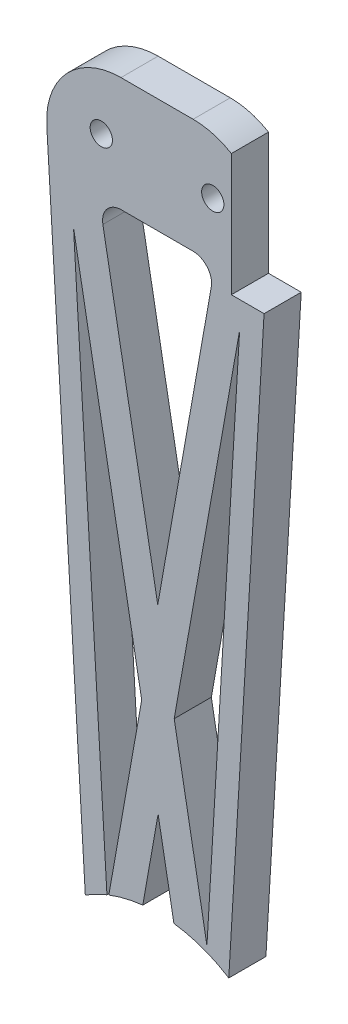
ISO-10303-21;
HEADER;
FILE_DESCRIPTION(('STEP AP214'),'2;1');
FILE_NAME('part.step','',(''),(''),'','','');
FILE_SCHEMA(('AUTOMOTIVE_DESIGN { 1 0 10303 214 1 1 1 1 }'));
ENDSEC;
DATA;
#1=APPLICATION_CONTEXT('core data for automotive mechanical design processes');
#2=APPLICATION_PROTOCOL_DEFINITION('international standard','automotive_design',2000,#1);
#3=PRODUCT_CONTEXT('',#1,'mechanical');
#4=PRODUCT('Part','Part','',(#3));
#5=PRODUCT_RELATED_PRODUCT_CATEGORY('part','',(#4));
#6=PRODUCT_DEFINITION_FORMATION('','',#4);
#7=PRODUCT_DEFINITION_CONTEXT('part definition',#1,'design');
#8=PRODUCT_DEFINITION('design','',#6,#7);
#9=PRODUCT_DEFINITION_SHAPE('','',#8);
#10=(LENGTH_UNIT() NAMED_UNIT(*) SI_UNIT(.MILLI.,.METRE.));
#11=(NAMED_UNIT(*) PLANE_ANGLE_UNIT() SI_UNIT($,.RADIAN.));
#12=(NAMED_UNIT(*) SI_UNIT($,.STERADIAN.) SOLID_ANGLE_UNIT());
#13=UNCERTAINTY_MEASURE_WITH_UNIT(LENGTH_MEASURE(1.E-05),#10,'distance_accuracy_value','');
#14=(GEOMETRIC_REPRESENTATION_CONTEXT(3) GLOBAL_UNCERTAINTY_ASSIGNED_CONTEXT((#13)) GLOBAL_UNIT_ASSIGNED_CONTEXT((#10,
#11,#12)) REPRESENTATION_CONTEXT('',''));
#15=CARTESIAN_POINT('',(0.,0.,0.));
#16=DIRECTION('',(0.,0.,1.));
#17=DIRECTION('',(1.,0.,0.));
#18=AXIS2_PLACEMENT_3D('',#15,#16,#17);
#19=CARTESIAN_POINT('',(0.,0.,10.));
#20=DIRECTION('',(0.,0.,1.));
#21=DIRECTION('',(1.,0.,0.));
#22=AXIS2_PLACEMENT_3D('',#19,#20,#21);
#23=PLANE('',#22);
#24=CARTESIAN_POINT('',(15.,0.,10.));
#25=DIRECTION('',(0.,0.,1.));
#26=DIRECTION('',(1.,0.,0.));
#27=AXIS2_PLACEMENT_3D('',#24,#25,#26);
#28=CIRCLE('',#27,3.);
#29=CARTESIAN_POINT('',(18.,0.,10.));
#30=VERTEX_POINT('',#29);
#31=EDGE_CURVE('E405',#30,#30,#28,.T.);
#32=ORIENTED_EDGE('',*,*,#31,.F.);
#33=EDGE_LOOP('',(#32));
#34=FACE_BOUND('',#33,.T.);
#35=CARTESIAN_POINT('',(-15.,0.,10.));
#36=DIRECTION('',(0.,0.,1.));
#37=DIRECTION('',(1.,0.,0.));
#38=AXIS2_PLACEMENT_3D('',#35,#36,#37);
#39=CIRCLE('',#38,3.);
#40=CARTESIAN_POINT('',(-12.,0.,10.));
#41=VERTEX_POINT('',#40);
#42=EDGE_CURVE('E408',#41,#41,#39,.T.);
#43=ORIENTED_EDGE('',*,*,#42,.F.);
#44=EDGE_LOOP('',(#43));
#45=FACE_BOUND('',#44,.T.);
#46=DIRECTION('',(0.174574666070561,0.984643938673444,0.));
#47=VECTOR('',#46,1.);
#48=CARTESIAN_POINT('',(17.7452712206691,-3.14618785126878,10.));
#49=LINE('',#48,#47);
#50=CARTESIAN_POINT('',(0.190220551076297,-102.160979768059,10.));
#51=VERTEX_POINT('',#50);
#52=CARTESIAN_POINT('',(14.6023785703389,-20.8728733303528,10.));
#53=VERTEX_POINT('',#52);
#54=EDGE_CURVE('E387',#51,#53,#49,.T.);
#55=ORIENTED_EDGE('',*,*,#54,.F.);
#56=DIRECTION('',(-0.178826073356073,0.983880701857724,0.));
#57=VECTOR('',#56,1.);
#58=CARTESIAN_POINT('',(-17.7904251161172,-3.23351384049256,10.));
#59=LINE('',#58,#57);
#60=CARTESIAN_POINT('',(-14.5805047462184,-20.8941303667804,10.));
#61=VERTEX_POINT('',#60);
#62=EDGE_CURVE('E349',#51,#61,#59,.T.);
#63=ORIENTED_EDGE('',*,*,#62,.T.);
#64=CARTESIAN_POINT('',(-9.66110123692979,-20.,10.));
#65=DIRECTION('',(0.,0.,1.));
#66=DIRECTION('',(1.,0.,0.));
#67=AXIS2_PLACEMENT_3D('',#64,#65,#66);
#68=CIRCLE('',#67,5.);
#69=CARTESIAN_POINT('',(-9.66110123692979,-15.,10.));
#70=VERTEX_POINT('',#69);
#71=EDGE_CURVE('E447',#61,#70,#68,.F.);
#72=ORIENTED_EDGE('',*,*,#71,.T.);
#73=DIRECTION('',(1.,0.,0.));
#74=VECTOR('',#73,1.);
#75=CARTESIAN_POINT('',(0.,-15.,10.));
#76=LINE('',#75,#74);
#77=CARTESIAN_POINT('',(9.67915887697167,-15.,10.));
#78=VERTEX_POINT('',#77);
#79=EDGE_CURVE('E378',#70,#78,#76,.T.);
#80=ORIENTED_EDGE('',*,*,#79,.T.);
#81=CARTESIAN_POINT('',(9.67915887697167,-20.,10.));
#82=DIRECTION('',(0.,0.,1.));
#83=DIRECTION('',(1.,0.,0.));
#84=AXIS2_PLACEMENT_3D('',#81,#82,#83);
#85=CIRCLE('',#84,5.);
#86=EDGE_CURVE('E115',#78,#53,#85,.F.);
#87=ORIENTED_EDGE('',*,*,#86,.T.);
#88=EDGE_LOOP('',(#55,#63,#72,#80,#87));
#89=FACE_BOUND('',#88,.T.);
#90=DIRECTION('',(-0.178826073356073,0.983880701857724,0.));
#91=VECTOR('',#90,1.);
#92=CARTESIAN_POINT('',(-17.7904251161172,-3.23351384049256,10.));
#93=LINE('',#92,#91);
#94=CARTESIAN_POINT('',(13.4301626709257,-175.005634358752,10.));
#95=VERTEX_POINT('',#94);
#96=CARTESIAN_POINT('',(4.61598635326493,-126.511039476885,10.));
#97=VERTEX_POINT('',#96);
#98=EDGE_CURVE('E363',#95,#97,#93,.T.);
#99=ORIENTED_EDGE('',*,*,#98,.T.);
#100=DIRECTION('',(0.174574666070561,0.984643938673444,0.));
#101=VECTOR('',#100,1.);
#102=CARTESIAN_POINT('',(26.2217824014059,-4.64905000346376,10.));
#103=LINE('',#102,#101);
#104=CARTESIAN_POINT('',(22.2304198411749,-27.1613138985647,10.));
#105=VERTEX_POINT('',#104);
#106=EDGE_CURVE('E329',#97,#105,#103,.T.);
#107=ORIENTED_EDGE('',*,*,#106,.T.);
#108=DIRECTION('',(-0.0594186399842153,-0.998233151734817,0.));
#109=VECTOR('',#108,1.);
#110=CARTESIAN_POINT('',(23.7629705178262,-1.41446253082299,10.));
#111=LINE('',#110,#109);
#112=EDGE_CURVE('E355',#105,#95,#111,.T.);
#113=ORIENTED_EDGE('',*,*,#112,.T.);
#114=EDGE_LOOP('',(#99,#107,#113));
#115=FACE_BOUND('',#114,.T.);
#116=DIRECTION('',(-0.0594186399842153,-0.998233151734817,0.));
#117=VECTOR('',#116,1.);
#118=CARTESIAN_POINT('',(29.8940827566728,-1.77940968789719,10.));
#119=LINE('',#118,#117);
#120=CARTESIAN_POINT('',(28.8095238095238,-20.,10.));
#121=VERTEX_POINT('',#120);
#122=CARTESIAN_POINT('',(19.3085635130686,-179.616132980448,10.));
#123=VERTEX_POINT('',#122);
#124=EDGE_CURVE('E398',#121,#123,#119,.T.);
#125=ORIENTED_EDGE('',*,*,#124,.F.);
#126=DIRECTION('',(-1.,0.,0.));
#127=VECTOR('',#126,1.);
#128=CARTESIAN_POINT('',(0.,-20.,10.));
#129=LINE('',#128,#127);
#130=CARTESIAN_POINT('',(20.,-20.,10.));
#131=VERTEX_POINT('',#130);
#132=EDGE_CURVE('E281',#121,#131,#129,.T.);
#133=ORIENTED_EDGE('',*,*,#132,.T.);
#134=DIRECTION('',(0.,-1.,0.));
#135=VECTOR('',#134,1.);
#136=CARTESIAN_POINT('',(20.,0.,10.));
#137=LINE('',#136,#135);
#138=CARTESIAN_POINT('',(20.,12.9219237424976,10.));
#139=VERTEX_POINT('',#138);
#140=EDGE_CURVE('E274',#139,#131,#137,.T.);
#141=ORIENTED_EDGE('',*,*,#140,.F.);
#142=CARTESIAN_POINT('',(9.71283934950197,-4.22958714578407,10.));
#143=DIRECTION('',(0.,0.,1.));
#144=DIRECTION('',(1.,0.,0.));
#145=AXIS2_PLACEMENT_3D('',#142,#143,#144);
#146=CIRCLE('',#145,20.);
#147=CARTESIAN_POINT('',(9.71283934950197,15.7704128542159,10.));
#148=VERTEX_POINT('',#147);
#149=EDGE_CURVE('E435',#139,#148,#146,.T.);
#150=ORIENTED_EDGE('',*,*,#149,.T.);
#151=DIRECTION('',(1.,0.,0.));
#152=VECTOR('',#151,1.);
#153=CARTESIAN_POINT('',(0.,15.7704128542159,10.));
#154=LINE('',#153,#152);
#155=CARTESIAN_POINT('',(-9.71283934950197,15.7704128542159,10.));
#156=VERTEX_POINT('',#155);
#157=EDGE_CURVE('E402',#156,#148,#154,.T.);
#158=ORIENTED_EDGE('',*,*,#157,.F.);
#159=CARTESIAN_POINT('',(-9.71283934950197,-4.22958714578407,10.));
#160=DIRECTION('',(0.,0.,1.));
#161=DIRECTION('',(1.,0.,0.));
#162=AXIS2_PLACEMENT_3D('',#159,#160,#161);
#163=CIRCLE('',#162,20.);
#164=CARTESIAN_POINT('',(-29.6775023841983,-5.41795994546837,10.));
#165=VERTEX_POINT('',#164);
#166=EDGE_CURVE('E429',#156,#165,#163,.T.);
#167=ORIENTED_EDGE('',*,*,#166,.T.);
#168=DIRECTION('',(0.0594186399842153,-0.998233151734817,0.));
#169=VECTOR('',#168,1.);
#170=CARTESIAN_POINT('',(-29.8940827566728,-1.77940968789719,10.));
#171=LINE('',#170,#169);
#172=CARTESIAN_POINT('',(-19.3085635130686,-179.616132980448,10.));
#173=VERTEX_POINT('',#172);
#174=EDGE_CURVE('E395',#165,#173,#171,.T.);
#175=ORIENTED_EDGE('',*,*,#174,.T.);
#176=CARTESIAN_POINT('',(0.,-210.,10.));
#177=DIRECTION('',(0.,0.,1.));
#178=DIRECTION('',(1.,0.,0.));
#179=AXIS2_PLACEMENT_3D('',#176,#177,#178);
#180=CIRCLE('',#179,36.);
#181=CARTESIAN_POINT('',(-13.4867994081427,-176.621769943202,10.));
#182=VERTEX_POINT('',#181);
#183=EDGE_CURVE('E302',#182,#173,#180,.T.);
#184=ORIENTED_EDGE('',*,*,#183,.F.);
#185=DIRECTION('',(-0.0594186399842153,0.998233151734817,0.));
#186=VECTOR('',#185,1.);
#187=CARTESIAN_POINT('',(-23.9152662053382,-1.42352775031775,10.));
#188=LINE('',#187,#186);
#189=CARTESIAN_POINT('',(-22.4730270714025,-25.6531452004381,10.));
#190=VERTEX_POINT('',#189);
#191=EDGE_CURVE('E339',#182,#190,#188,.T.);
#192=ORIENTED_EDGE('',*,*,#191,.T.);
#193=DIRECTION('',(-0.178826073356073,0.983880701857724,0.));
#194=VECTOR('',#193,1.);
#195=CARTESIAN_POINT('',(-26.2678721622271,-4.77433943497515,10.));
#196=LINE('',#195,#194);
#197=CARTESIAN_POINT('',(-4.13415620386734,-126.551525407566,10.));
#198=VERTEX_POINT('',#197);
#199=EDGE_CURVE('E333',#198,#190,#196,.T.);
#200=ORIENTED_EDGE('',*,*,#199,.F.);
#201=DIRECTION('',(0.174574666070561,0.984643938673444,0.));
#202=VECTOR('',#201,1.);
#203=CARTESIAN_POINT('',(17.7452712206691,-3.14618785126878,10.));
#204=LINE('',#203,#202);
#205=CARTESIAN_POINT('',(-12.9756578020108,-176.419763184201,10.));
#206=VERTEX_POINT('',#205);
#207=EDGE_CURVE('E341',#206,#198,#204,.T.);
#208=ORIENTED_EDGE('',*,*,#207,.F.);
#209=CARTESIAN_POINT('',(0.,-210.,10.));
#210=DIRECTION('',(0.,0.,1.));
#211=DIRECTION('',(1.,0.,0.));
#212=AXIS2_PLACEMENT_3D('',#209,#210,#211);
#213=CIRCLE('',#212,36.);
#214=CARTESIAN_POINT('',(-3.84009202515425,-174.205395752455,10.));
#215=VERTEX_POINT('',#214);
#216=EDGE_CURVE('E300',#215,#206,#213,.T.);
#217=ORIENTED_EDGE('',*,*,#216,.F.);
#218=DIRECTION('',(0.174574666070561,0.984643938673444,0.));
#219=VECTOR('',#218,1.);
#220=CARTESIAN_POINT('',(26.2217824014059,-4.64905000346376,10.));
#221=LINE('',#220,#219);
#222=CARTESIAN_POINT('',(0.29160959832128,-150.901585116392,10.));
#223=VERTEX_POINT('',#222);
#224=EDGE_CURVE('E321',#215,#223,#221,.T.);
#225=ORIENTED_EDGE('',*,*,#224,.T.);
#226=DIRECTION('',(-0.178826073356073,0.983880701857724,0.));
#227=VECTOR('',#226,1.);
#228=CARTESIAN_POINT('',(-26.2678721622271,-4.77433943497515,10.));
#229=LINE('',#228,#227);
#230=CARTESIAN_POINT('',(4.54217202074157,-174.287695771149,10.));
#231=VERTEX_POINT('',#230);
#232=EDGE_CURVE('E287',#231,#223,#229,.T.);
#233=ORIENTED_EDGE('',*,*,#232,.F.);
#234=CARTESIAN_POINT('',(0.,-210.,10.));
#235=DIRECTION('',(0.,0.,1.));
#236=DIRECTION('',(1.,0.,0.));
#237=AXIS2_PLACEMENT_3D('',#234,#235,#236);
#238=CIRCLE('',#237,36.);
#239=EDGE_CURVE('E130',#123,#231,#238,.T.);
#240=ORIENTED_EDGE('',*,*,#239,.F.);
#241=EDGE_LOOP('',(#125,#133,#141,#150,#158,#167,#175,#184,#192,#200,#208,#217,#225,#233,#240));
#242=FACE_BOUND('',#241,.T.);
#243=ADVANCED_FACE('F107',(#34,#45,#89,#115,#242),#23,.T.);
#244=CARTESIAN_POINT('',(0.,0.,0.));
#245=DIRECTION('',(0.,0.,1.));
#246=DIRECTION('',(1.,0.,0.));
#247=AXIS2_PLACEMENT_3D('',#244,#245,#246);
#248=PLANE('',#247);
#249=CARTESIAN_POINT('',(-15.,0.,0.));
#250=DIRECTION('',(0.,0.,1.));
#251=DIRECTION('',(1.,0.,0.));
#252=AXIS2_PLACEMENT_3D('',#249,#250,#251);
#253=CIRCLE('',#252,3.);
#254=CARTESIAN_POINT('',(-12.,0.,0.));
#255=VERTEX_POINT('',#254);
#256=EDGE_CURVE('E399',#255,#255,#253,.T.);
#257=ORIENTED_EDGE('',*,*,#256,.T.);
#258=EDGE_LOOP('',(#257));
#259=FACE_BOUND('',#258,.T.);
#260=CARTESIAN_POINT('',(15.,0.,0.));
#261=DIRECTION('',(0.,0.,1.));
#262=DIRECTION('',(1.,0.,0.));
#263=AXIS2_PLACEMENT_3D('',#260,#261,#262);
#264=CIRCLE('',#263,3.);
#265=CARTESIAN_POINT('',(18.,0.,0.));
#266=VERTEX_POINT('',#265);
#267=EDGE_CURVE('E418',#266,#266,#264,.T.);
#268=ORIENTED_EDGE('',*,*,#267,.T.);
#269=EDGE_LOOP('',(#268));
#270=FACE_BOUND('',#269,.T.);
#271=DIRECTION('',(-0.178826073356073,0.983880701857724,0.));
#272=VECTOR('',#271,1.);
#273=CARTESIAN_POINT('',(-17.7904251161172,-3.23351384049256,0.));
#274=LINE('',#273,#272);
#275=CARTESIAN_POINT('',(0.190220551076304,-102.160979768059,0.));
#276=VERTEX_POINT('',#275);
#277=CARTESIAN_POINT('',(-14.5805047462184,-20.8941303667804,0.));
#278=VERTEX_POINT('',#277);
#279=EDGE_CURVE('E374',#276,#278,#274,.T.);
#280=ORIENTED_EDGE('',*,*,#279,.F.);
#281=DIRECTION('',(0.174574666070561,0.984643938673444,0.));
#282=VECTOR('',#281,1.);
#283=CARTESIAN_POINT('',(17.7452712206691,-3.14618785126878,0.));
#284=LINE('',#283,#282);
#285=CARTESIAN_POINT('',(14.6023785703389,-20.8728733303528,0.));
#286=VERTEX_POINT('',#285);
#287=EDGE_CURVE('E377',#276,#286,#284,.T.);
#288=ORIENTED_EDGE('',*,*,#287,.T.);
#289=CARTESIAN_POINT('',(9.67915887697167,-20.,0.));
#290=DIRECTION('',(0.,0.,1.));
#291=DIRECTION('',(1.,0.,0.));
#292=AXIS2_PLACEMENT_3D('',#289,#290,#291);
#293=CIRCLE('',#292,5.);
#294=CARTESIAN_POINT('',(9.67915887697167,-15.,0.));
#295=VERTEX_POINT('',#294);
#296=EDGE_CURVE('E12',#286,#295,#293,.T.);
#297=ORIENTED_EDGE('',*,*,#296,.T.);
#298=DIRECTION('',(1.,0.,0.));
#299=VECTOR('',#298,1.);
#300=CARTESIAN_POINT('',(0.,-15.,0.));
#301=LINE('',#300,#299);
#302=CARTESIAN_POINT('',(-9.66110123692979,-15.,0.));
#303=VERTEX_POINT('',#302);
#304=EDGE_CURVE('E381',#303,#295,#301,.T.);
#305=ORIENTED_EDGE('',*,*,#304,.F.);
#306=CARTESIAN_POINT('',(-9.66110123692979,-20.,0.));
#307=DIRECTION('',(0.,0.,1.));
#308=DIRECTION('',(1.,0.,0.));
#309=AXIS2_PLACEMENT_3D('',#306,#307,#308);
#310=CIRCLE('',#309,5.);
#311=EDGE_CURVE('E449',#303,#278,#310,.T.);
#312=ORIENTED_EDGE('',*,*,#311,.T.);
#313=EDGE_LOOP('',(#280,#288,#297,#305,#312));
#314=FACE_BOUND('',#313,.T.);
#315=DIRECTION('',(0.174574666070561,0.984643938673444,0.));
#316=VECTOR('',#315,1.);
#317=CARTESIAN_POINT('',(26.2217824014059,-4.64905000346376,0.));
#318=LINE('',#317,#316);
#319=CARTESIAN_POINT('',(4.61598635326493,-126.511039476885,0.));
#320=VERTEX_POINT('',#319);
#321=CARTESIAN_POINT('',(22.2304198411749,-27.1613138985647,0.));
#322=VERTEX_POINT('',#321);
#323=EDGE_CURVE('E352',#320,#322,#318,.T.);
#324=ORIENTED_EDGE('',*,*,#323,.F.);
#325=DIRECTION('',(-0.178826073356073,0.983880701857724,0.));
#326=VECTOR('',#325,1.);
#327=CARTESIAN_POINT('',(-17.7904251161172,-3.23351384049256,0.));
#328=LINE('',#327,#326);
#329=CARTESIAN_POINT('',(13.4301626709257,-175.005634358752,0.));
#330=VERTEX_POINT('',#329);
#331=EDGE_CURVE('E354',#330,#320,#328,.T.);
#332=ORIENTED_EDGE('',*,*,#331,.F.);
#333=DIRECTION('',(-0.0594186399842153,-0.998233151734817,0.));
#334=VECTOR('',#333,1.);
#335=CARTESIAN_POINT('',(23.7629705178262,-1.41446253082299,0.));
#336=LINE('',#335,#334);
#337=EDGE_CURVE('E357',#322,#330,#336,.T.);
#338=ORIENTED_EDGE('',*,*,#337,.F.);
#339=EDGE_LOOP('',(#324,#332,#338));
#340=FACE_BOUND('',#339,.T.);
#341=DIRECTION('',(-1.,0.,0.));
#342=VECTOR('',#341,1.);
#343=CARTESIAN_POINT('',(0.,-20.,0.));
#344=LINE('',#343,#342);
#345=CARTESIAN_POINT('',(28.8095238095238,-20.,0.));
#346=VERTEX_POINT('',#345);
#347=CARTESIAN_POINT('',(20.,-20.,0.));
#348=VERTEX_POINT('',#347);
#349=EDGE_CURVE('E261',#346,#348,#344,.T.);
#350=ORIENTED_EDGE('',*,*,#349,.F.);
#351=DIRECTION('',(-0.0594186399842153,-0.998233151734817,0.));
#352=VECTOR('',#351,1.);
#353=CARTESIAN_POINT('',(29.8940827566728,-1.77940968789719,0.));
#354=LINE('',#353,#352);
#355=CARTESIAN_POINT('',(19.3085635130686,-179.616132980448,0.));
#356=VERTEX_POINT('',#355);
#357=EDGE_CURVE('E414',#346,#356,#354,.T.);
#358=ORIENTED_EDGE('',*,*,#357,.T.);
#359=CARTESIAN_POINT('',(0.,-210.,0.));
#360=DIRECTION('',(0.,0.,1.));
#361=DIRECTION('',(1.,0.,0.));
#362=AXIS2_PLACEMENT_3D('',#359,#360,#361);
#363=CIRCLE('',#362,36.);
#364=CARTESIAN_POINT('',(4.54217202074156,-174.287695771149,0.));
#365=VERTEX_POINT('',#364);
#366=EDGE_CURVE('E296',#356,#365,#363,.T.);
#367=ORIENTED_EDGE('',*,*,#366,.T.);
#368=DIRECTION('',(-0.178826073356073,0.983880701857724,0.));
#369=VECTOR('',#368,1.);
#370=CARTESIAN_POINT('',(-26.2678721622271,-4.77433943497515,0.));
#371=LINE('',#370,#369);
#372=CARTESIAN_POINT('',(0.291609598321283,-150.901585116392,0.));
#373=VERTEX_POINT('',#372);
#374=EDGE_CURVE('E317',#365,#373,#371,.T.);
#375=ORIENTED_EDGE('',*,*,#374,.T.);
#376=DIRECTION('',(0.174574666070561,0.984643938673444,0.));
#377=VECTOR('',#376,1.);
#378=CARTESIAN_POINT('',(26.2217824014059,-4.64905000346376,0.));
#379=LINE('',#378,#377);
#380=CARTESIAN_POINT('',(-3.84009202515425,-174.205395752455,0.));
#381=VERTEX_POINT('',#380);
#382=EDGE_CURVE('E320',#381,#373,#379,.T.);
#383=ORIENTED_EDGE('',*,*,#382,.F.);
#384=CARTESIAN_POINT('',(0.,-210.,0.));
#385=DIRECTION('',(0.,0.,1.));
#386=DIRECTION('',(1.,0.,0.));
#387=AXIS2_PLACEMENT_3D('',#384,#385,#386);
#388=CIRCLE('',#387,36.);
#389=CARTESIAN_POINT('',(-12.9756578020108,-176.419763184201,0.));
#390=VERTEX_POINT('',#389);
#391=EDGE_CURVE('E290',#381,#390,#388,.T.);
#392=ORIENTED_EDGE('',*,*,#391,.T.);
#393=DIRECTION('',(0.174574666070561,0.984643938673444,0.));
#394=VECTOR('',#393,1.);
#395=CARTESIAN_POINT('',(17.7452712206691,-3.14618785126878,0.));
#396=LINE('',#395,#394);
#397=CARTESIAN_POINT('',(-4.13415620386734,-126.551525407566,0.));
#398=VERTEX_POINT('',#397);
#399=EDGE_CURVE('E332',#390,#398,#396,.T.);
#400=ORIENTED_EDGE('',*,*,#399,.T.);
#401=DIRECTION('',(-0.178826073356073,0.983880701857724,0.));
#402=VECTOR('',#401,1.);
#403=CARTESIAN_POINT('',(-26.2678721622271,-4.77433943497515,0.));
#404=LINE('',#403,#402);
#405=CARTESIAN_POINT('',(-22.4730270714025,-25.6531452004381,0.));
#406=VERTEX_POINT('',#405);
#407=EDGE_CURVE('E335',#398,#406,#404,.T.);
#408=ORIENTED_EDGE('',*,*,#407,.T.);
#409=DIRECTION('',(-0.0594186399842153,0.998233151734817,0.));
#410=VECTOR('',#409,1.);
#411=CARTESIAN_POINT('',(-23.9152662053382,-1.42352775031775,0.));
#412=LINE('',#411,#410);
#413=CARTESIAN_POINT('',(-13.4867994081427,-176.621769943202,0.));
#414=VERTEX_POINT('',#413);
#415=EDGE_CURVE('E330',#414,#406,#412,.T.);
#416=ORIENTED_EDGE('',*,*,#415,.F.);
#417=CARTESIAN_POINT('',(0.,-210.,0.));
#418=DIRECTION('',(0.,0.,1.));
#419=DIRECTION('',(1.,0.,0.));
#420=AXIS2_PLACEMENT_3D('',#417,#418,#419);
#421=CIRCLE('',#420,36.);
#422=CARTESIAN_POINT('',(-19.3085635130686,-179.616132980448,0.));
#423=VERTEX_POINT('',#422);
#424=EDGE_CURVE('E293',#414,#423,#421,.T.);
#425=ORIENTED_EDGE('',*,*,#424,.T.);
#426=DIRECTION('',(0.0594186399842153,-0.998233151734817,0.));
#427=VECTOR('',#426,1.);
#428=CARTESIAN_POINT('',(-29.8940827566728,-1.77940968789719,0.));
#429=LINE('',#428,#427);
#430=CARTESIAN_POINT('',(-29.6775023841983,-5.41795994546837,0.));
#431=VERTEX_POINT('',#430);
#432=EDGE_CURVE('E394',#431,#423,#429,.T.);
#433=ORIENTED_EDGE('',*,*,#432,.F.);
#434=CARTESIAN_POINT('',(-9.71283934950197,-4.22958714578407,0.));
#435=DIRECTION('',(0.,0.,1.));
#436=DIRECTION('',(1.,0.,0.));
#437=AXIS2_PLACEMENT_3D('',#434,#435,#436);
#438=CIRCLE('',#437,20.);
#439=CARTESIAN_POINT('',(-9.71283934950197,15.7704128542159,0.));
#440=VERTEX_POINT('',#439);
#441=EDGE_CURVE('E425',#431,#440,#438,.F.);
#442=ORIENTED_EDGE('',*,*,#441,.T.);
#443=DIRECTION('',(1.,0.,0.));
#444=VECTOR('',#443,1.);
#445=CARTESIAN_POINT('',(0.,15.7704128542159,0.));
#446=LINE('',#445,#444);
#447=CARTESIAN_POINT('',(9.71283934950197,15.7704128542159,0.));
#448=VERTEX_POINT('',#447);
#449=EDGE_CURVE('E416',#440,#448,#446,.T.);
#450=ORIENTED_EDGE('',*,*,#449,.T.);
#451=CARTESIAN_POINT('',(9.71283934950197,-4.22958714578407,0.));
#452=DIRECTION('',(0.,0.,1.));
#453=DIRECTION('',(1.,0.,0.));
#454=AXIS2_PLACEMENT_3D('',#451,#452,#453);
#455=CIRCLE('',#454,20.);
#456=CARTESIAN_POINT('',(20.,12.9219237424976,0.));
#457=VERTEX_POINT('',#456);
#458=EDGE_CURVE('E280',#448,#457,#455,.F.);
#459=ORIENTED_EDGE('',*,*,#458,.T.);
#460=DIRECTION('',(0.,-1.,0.));
#461=VECTOR('',#460,1.);
#462=CARTESIAN_POINT('',(20.,0.,0.));
#463=LINE('',#462,#461);
#464=EDGE_CURVE('E122',#457,#348,#463,.T.);
#465=ORIENTED_EDGE('',*,*,#464,.T.);
#466=EDGE_LOOP('',(#350,#358,#367,#375,#383,#392,#400,#408,#416,#425,#433,#442,#450,#459,#465));
#467=FACE_BOUND('',#466,.T.);
#468=ADVANCED_FACE('F278',(#259,#270,#314,#340,#467),#248,.F.);
#469=CARTESIAN_POINT('',(29.8940827566728,-1.77940968789719,10.));
#470=DIRECTION('',(0.998233151734817,-0.0594186399842152,0.));
#471=DIRECTION('',(0.0594186399842152,0.998233151734817,0.));
#472=AXIS2_PLACEMENT_3D('',#469,#470,#471);
#473=PLANE('',#472);
#474=ORIENTED_EDGE('',*,*,#357,.F.);
#475=DIRECTION('',(0.,0.,1.));
#476=VECTOR('',#475,1.);
#477=CARTESIAN_POINT('',(28.8095238095238,-20.,0.));
#478=LINE('',#477,#476);
#479=EDGE_CURVE('E266',#346,#121,#478,.T.);
#480=ORIENTED_EDGE('',*,*,#479,.T.);
#481=ORIENTED_EDGE('',*,*,#124,.T.);
#482=DIRECTION('',(0.,0.,1.));
#483=VECTOR('',#482,1.);
#484=CARTESIAN_POINT('',(19.3085635130686,-179.616132980448,0.));
#485=LINE('',#484,#483);
#486=EDGE_CURVE('E306',#356,#123,#485,.T.);
#487=ORIENTED_EDGE('',*,*,#486,.F.);
#488=EDGE_LOOP('',(#474,#480,#481,#487));
#489=FACE_BOUND('',#488,.T.);
#490=ADVANCED_FACE('F494',(#489),#473,.T.);
#491=CARTESIAN_POINT('',(-29.8940827566728,-1.77940968789719,10.));
#492=DIRECTION('',(0.998233151734817,0.0594186399842152,0.));
#493=DIRECTION('',(-0.0594186399842152,0.998233151734817,0.));
#494=AXIS2_PLACEMENT_3D('',#491,#492,#493);
#495=PLANE('',#494);
#496=ORIENTED_EDGE('',*,*,#432,.T.);
#497=DIRECTION('',(0.,0.,1.));
#498=VECTOR('',#497,1.);
#499=CARTESIAN_POINT('',(-19.3085635130686,-179.616132980448,0.));
#500=LINE('',#499,#498);
#501=EDGE_CURVE('E308',#423,#173,#500,.T.);
#502=ORIENTED_EDGE('',*,*,#501,.T.);
#503=ORIENTED_EDGE('',*,*,#174,.F.);
#504=DIRECTION('',(0.,0.,-1.));
#505=VECTOR('',#504,1.);
#506=CARTESIAN_POINT('',(-29.6775023841983,-5.41795994546837,0.));
#507=LINE('',#506,#505);
#508=EDGE_CURVE('E411',#165,#431,#507,.T.);
#509=ORIENTED_EDGE('',*,*,#508,.T.);
#510=EDGE_LOOP('',(#496,#502,#503,#509));
#511=FACE_BOUND('',#510,.T.);
#512=ADVANCED_FACE('F511',(#511),#495,.F.);
#513=CARTESIAN_POINT('',(0.,15.7704128542159,10.));
#514=DIRECTION('',(0.,1.,0.));
#515=DIRECTION('',(0.,0.,1.));
#516=AXIS2_PLACEMENT_3D('',#513,#514,#515);
#517=PLANE('',#516);
#518=ORIENTED_EDGE('',*,*,#157,.T.);
#519=DIRECTION('',(0.,0.,-1.));
#520=VECTOR('',#519,1.);
#521=CARTESIAN_POINT('',(9.71283934950197,15.7704128542159,10.));
#522=LINE('',#521,#520);
#523=EDGE_CURVE('E431',#148,#448,#522,.T.);
#524=ORIENTED_EDGE('',*,*,#523,.T.);
#525=ORIENTED_EDGE('',*,*,#449,.F.);
#526=DIRECTION('',(0.,0.,-1.));
#527=VECTOR('',#526,1.);
#528=CARTESIAN_POINT('',(-9.71283934950197,15.7704128542159,10.));
#529=LINE('',#528,#527);
#530=EDGE_CURVE('E427',#440,#156,#529,.F.);
#531=ORIENTED_EDGE('',*,*,#530,.T.);
#532=EDGE_LOOP('',(#518,#524,#525,#531));
#533=FACE_BOUND('',#532,.T.);
#534=ADVANCED_FACE('F504',(#533),#517,.T.);
#535=CARTESIAN_POINT('',(-15.,0.,10.));
#536=DIRECTION('',(0.,0.,-1.));
#537=DIRECTION('',(-1.,0.,0.));
#538=AXIS2_PLACEMENT_3D('',#535,#536,#537);
#539=CYLINDRICAL_SURFACE('',#538,3.);
#540=ORIENTED_EDGE('',*,*,#42,.T.);
#541=EDGE_LOOP('',(#540));
#542=FACE_BOUND('',#541,.T.);
#543=ORIENTED_EDGE('',*,*,#256,.F.);
#544=EDGE_LOOP('',(#543));
#545=FACE_BOUND('',#544,.T.);
#546=ADVANCED_FACE('F500',(#542,#545),#539,.F.);
#547=CARTESIAN_POINT('',(15.,0.,10.));
#548=DIRECTION('',(0.,0.,-1.));
#549=DIRECTION('',(-1.,0.,0.));
#550=AXIS2_PLACEMENT_3D('',#547,#548,#549);
#551=CYLINDRICAL_SURFACE('',#550,3.);
#552=ORIENTED_EDGE('',*,*,#31,.T.);
#553=EDGE_LOOP('',(#552));
#554=FACE_BOUND('',#553,.T.);
#555=ORIENTED_EDGE('',*,*,#267,.F.);
#556=EDGE_LOOP('',(#555));
#557=FACE_BOUND('',#556,.T.);
#558=ADVANCED_FACE('F503',(#554,#557),#551,.F.);
#559=CARTESIAN_POINT('',(-9.71283934950197,-4.22958714578407,10.));
#560=DIRECTION('',(0.,0.,1.));
#561=DIRECTION('',(1.,0.,0.));
#562=AXIS2_PLACEMENT_3D('',#559,#560,#561);
#563=CYLINDRICAL_SURFACE('',#562,20.);
#564=ORIENTED_EDGE('',*,*,#166,.F.);
#565=ORIENTED_EDGE('',*,*,#530,.F.);
#566=ORIENTED_EDGE('',*,*,#441,.F.);
#567=ORIENTED_EDGE('',*,*,#508,.F.);
#568=EDGE_LOOP('',(#564,#565,#566,#567));
#569=FACE_BOUND('',#568,.T.);
#570=ADVANCED_FACE('F483',(#569),#563,.T.);
#571=CARTESIAN_POINT('',(9.71283934950197,-4.22958714578407,10.));
#572=DIRECTION('',(0.,0.,-1.));
#573=DIRECTION('',(-1.,0.,0.));
#574=AXIS2_PLACEMENT_3D('',#571,#572,#573);
#575=CYLINDRICAL_SURFACE('',#574,20.);
#576=DIRECTION('',(0.,0.,1.));
#577=VECTOR('',#576,1.);
#578=CARTESIAN_POINT('',(20.,12.9219237424976,0.));
#579=LINE('',#578,#577);
#580=EDGE_CURVE('E270',#457,#139,#579,.T.);
#581=ORIENTED_EDGE('',*,*,#580,.F.);
#582=ORIENTED_EDGE('',*,*,#458,.F.);
#583=ORIENTED_EDGE('',*,*,#523,.F.);
#584=ORIENTED_EDGE('',*,*,#149,.F.);
#585=EDGE_LOOP('',(#581,#582,#583,#584));
#586=FACE_BOUND('',#585,.T.);
#587=ADVANCED_FACE('F475',(#586),#575,.T.);
#588=CARTESIAN_POINT('',(-17.7904251161172,-3.23351384049256,0.));
#589=DIRECTION('',(0.983880701857725,0.178826073356073,0.));
#590=DIRECTION('',(-0.178826073356073,0.983880701857725,0.));
#591=AXIS2_PLACEMENT_3D('',#588,#589,#590);
#592=PLANE('',#591);
#593=ORIENTED_EDGE('',*,*,#279,.T.);
#594=DIRECTION('',(0.,0.,1.));
#595=VECTOR('',#594,1.);
#596=CARTESIAN_POINT('',(-14.5805047462184,-20.8941303667804,10.));
#597=LINE('',#596,#595);
#598=EDGE_CURVE('E437',#278,#61,#597,.T.);
#599=ORIENTED_EDGE('',*,*,#598,.T.);
#600=ORIENTED_EDGE('',*,*,#62,.F.);
#601=DIRECTION('',(0.,0.,1.));
#602=VECTOR('',#601,1.);
#603=CARTESIAN_POINT('',(0.190220551076304,-102.160979768059,0.));
#604=LINE('',#603,#602);
#605=EDGE_CURVE('E384',#276,#51,#604,.T.);
#606=ORIENTED_EDGE('',*,*,#605,.F.);
#607=EDGE_LOOP('',(#593,#599,#600,#606));
#608=FACE_BOUND('',#607,.T.);
#609=ADVANCED_FACE('F473',(#608),#592,.T.);
#610=CARTESIAN_POINT('',(0.,-15.,0.));
#611=DIRECTION('',(0.,-1.,0.));
#612=DIRECTION('',(0.,0.,-1.));
#613=AXIS2_PLACEMENT_3D('',#610,#611,#612);
#614=PLANE('',#613);
#615=ORIENTED_EDGE('',*,*,#79,.F.);
#616=DIRECTION('',(0.,0.,1.));
#617=VECTOR('',#616,1.);
#618=CARTESIAN_POINT('',(-9.66110123692979,-15.,0.));
#619=LINE('',#618,#617);
#620=EDGE_CURVE('E443',#70,#303,#619,.F.);
#621=ORIENTED_EDGE('',*,*,#620,.T.);
#622=ORIENTED_EDGE('',*,*,#304,.T.);
#623=DIRECTION('',(0.,0.,1.));
#624=VECTOR('',#623,1.);
#625=CARTESIAN_POINT('',(9.67915887697167,-15.,0.));
#626=LINE('',#625,#624);
#627=EDGE_CURVE('E440',#295,#78,#626,.T.);
#628=ORIENTED_EDGE('',*,*,#627,.T.);
#629=EDGE_LOOP('',(#615,#621,#622,#628));
#630=FACE_BOUND('',#629,.T.);
#631=ADVANCED_FACE('F467',(#630),#614,.T.);
#632=CARTESIAN_POINT('',(17.7452712206691,-3.14618785126878,0.));
#633=DIRECTION('',(0.984643938673444,-0.174574666070561,0.));
#634=DIRECTION('',(0.174574666070561,0.984643938673444,0.));
#635=AXIS2_PLACEMENT_3D('',#632,#633,#634);
#636=PLANE('',#635);
#637=ORIENTED_EDGE('',*,*,#54,.T.);
#638=DIRECTION('',(0.,0.,1.));
#639=VECTOR('',#638,1.);
#640=CARTESIAN_POINT('',(14.6023785703389,-20.8728733303528,0.));
#641=LINE('',#640,#639);
#642=EDGE_CURVE('E445',#53,#286,#641,.F.);
#643=ORIENTED_EDGE('',*,*,#642,.T.);
#644=ORIENTED_EDGE('',*,*,#287,.F.);
#645=ORIENTED_EDGE('',*,*,#605,.T.);
#646=EDGE_LOOP('',(#637,#643,#644,#645));
#647=FACE_BOUND('',#646,.T.);
#648=ADVANCED_FACE('F458',(#647),#636,.F.);
#649=CARTESIAN_POINT('',(26.2217824014059,-4.64905000346376,0.));
#650=DIRECTION('',(0.984643938673444,-0.174574666070561,0.));
#651=DIRECTION('',(0.174574666070561,0.984643938673444,0.));
#652=AXIS2_PLACEMENT_3D('',#649,#650,#651);
#653=PLANE('',#652);
#654=DIRECTION('',(0.,0.,1.));
#655=VECTOR('',#654,1.);
#656=CARTESIAN_POINT('',(-3.84009202515425,-174.205395752455,0.));
#657=LINE('',#656,#655);
#658=EDGE_CURVE('E299',#381,#215,#657,.T.);
#659=ORIENTED_EDGE('',*,*,#658,.F.);
#660=ORIENTED_EDGE('',*,*,#382,.T.);
#661=DIRECTION('',(0.,0.,1.));
#662=VECTOR('',#661,1.);
#663=CARTESIAN_POINT('',(0.29160959832128,-150.901585116392,0.));
#664=LINE('',#663,#662);
#665=EDGE_CURVE('E323',#373,#223,#664,.T.);
#666=ORIENTED_EDGE('',*,*,#665,.T.);
#667=ORIENTED_EDGE('',*,*,#224,.F.);
#668=EDGE_LOOP('',(#659,#660,#666,#667));
#669=FACE_BOUND('',#668,.T.);
#670=ADVANCED_FACE('F556',(#669),#653,.T.);
#671=CARTESIAN_POINT('',(-26.2678721622271,-4.77433943497515,0.));
#672=DIRECTION('',(0.983880701857725,0.178826073356073,0.));
#673=DIRECTION('',(-0.178826073356073,0.983880701857725,0.));
#674=AXIS2_PLACEMENT_3D('',#671,#672,#673);
#675=PLANE('',#674);
#676=ORIENTED_EDGE('',*,*,#374,.F.);
#677=DIRECTION('',(0.,0.,1.));
#678=VECTOR('',#677,1.);
#679=CARTESIAN_POINT('',(4.54217202074156,-174.287695771149,0.));
#680=LINE('',#679,#678);
#681=EDGE_CURVE('E285',#365,#231,#680,.T.);
#682=ORIENTED_EDGE('',*,*,#681,.T.);
#683=ORIENTED_EDGE('',*,*,#232,.T.);
#684=ORIENTED_EDGE('',*,*,#665,.F.);
#685=EDGE_LOOP('',(#676,#682,#683,#684));
#686=FACE_BOUND('',#685,.T.);
#687=ADVANCED_FACE('F553',(#686),#675,.F.);
#688=CARTESIAN_POINT('',(26.2217824014059,-4.64905000346376,0.));
#689=DIRECTION('',(0.984643938673444,-0.174574666070561,0.));
#690=DIRECTION('',(0.174574666070561,0.984643938673444,0.));
#691=AXIS2_PLACEMENT_3D('',#688,#689,#690);
#692=PLANE('',#691);
#693=ORIENTED_EDGE('',*,*,#106,.F.);
#694=DIRECTION('',(0.,0.,1.));
#695=VECTOR('',#694,1.);
#696=CARTESIAN_POINT('',(4.61598635326493,-126.511039476885,0.));
#697=LINE('',#696,#695);
#698=EDGE_CURVE('E360',#320,#97,#697,.T.);
#699=ORIENTED_EDGE('',*,*,#698,.F.);
#700=ORIENTED_EDGE('',*,*,#323,.T.);
#701=DIRECTION('',(0.,0.,1.));
#702=VECTOR('',#701,1.);
#703=CARTESIAN_POINT('',(22.2304198411749,-27.1613138985647,0.));
#704=LINE('',#703,#702);
#705=EDGE_CURVE('E342',#322,#105,#704,.T.);
#706=ORIENTED_EDGE('',*,*,#705,.T.);
#707=EDGE_LOOP('',(#693,#699,#700,#706));
#708=FACE_BOUND('',#707,.T.);
#709=ADVANCED_FACE('F547',(#708),#692,.T.);
#710=CARTESIAN_POINT('',(23.7629705178262,-1.41446253082299,0.));
#711=DIRECTION('',(-0.998233151734817,0.0594186399842153,0.));
#712=DIRECTION('',(-0.0594186399842153,-0.998233151734817,0.));
#713=AXIS2_PLACEMENT_3D('',#710,#711,#712);
#714=PLANE('',#713);
#715=ORIENTED_EDGE('',*,*,#112,.F.);
#716=ORIENTED_EDGE('',*,*,#705,.F.);
#717=ORIENTED_EDGE('',*,*,#337,.T.);
#718=DIRECTION('',(0.,0.,1.));
#719=VECTOR('',#718,1.);
#720=CARTESIAN_POINT('',(13.4301626709257,-175.005634358752,0.));
#721=LINE('',#720,#719);
#722=EDGE_CURVE('E370',#330,#95,#721,.T.);
#723=ORIENTED_EDGE('',*,*,#722,.T.);
#724=EDGE_LOOP('',(#715,#716,#717,#723));
#725=FACE_BOUND('',#724,.T.);
#726=ADVANCED_FACE('F544',(#725),#714,.T.);
#727=CARTESIAN_POINT('',(-17.7904251161172,-3.23351384049256,0.));
#728=DIRECTION('',(0.983880701857725,0.178826073356073,0.));
#729=DIRECTION('',(-0.178826073356073,0.983880701857725,0.));
#730=AXIS2_PLACEMENT_3D('',#727,#728,#729);
#731=PLANE('',#730);
#732=ORIENTED_EDGE('',*,*,#98,.F.);
#733=ORIENTED_EDGE('',*,*,#722,.F.);
#734=ORIENTED_EDGE('',*,*,#331,.T.);
#735=ORIENTED_EDGE('',*,*,#698,.T.);
#736=EDGE_LOOP('',(#732,#733,#734,#735));
#737=FACE_BOUND('',#736,.T.);
#738=ADVANCED_FACE('F542',(#737),#731,.T.);
#739=CARTESIAN_POINT('',(-23.9152662053382,-1.42352775031775,0.));
#740=DIRECTION('',(0.998233151734817,0.0594186399842153,0.));
#741=DIRECTION('',(-0.0594186399842153,0.998233151734817,0.));
#742=AXIS2_PLACEMENT_3D('',#739,#740,#741);
#743=PLANE('',#742);
#744=DIRECTION('',(0.,0.,1.));
#745=VECTOR('',#744,1.);
#746=CARTESIAN_POINT('',(-13.4867994081427,-176.621769943202,0.));
#747=LINE('',#746,#745);
#748=EDGE_CURVE('E311',#414,#182,#747,.T.);
#749=ORIENTED_EDGE('',*,*,#748,.F.);
#750=ORIENTED_EDGE('',*,*,#415,.T.);
#751=DIRECTION('',(0.,0.,1.));
#752=VECTOR('',#751,1.);
#753=CARTESIAN_POINT('',(-22.4730270714025,-25.6531452004381,0.));
#754=LINE('',#753,#752);
#755=EDGE_CURVE('E346',#406,#190,#754,.T.);
#756=ORIENTED_EDGE('',*,*,#755,.T.);
#757=ORIENTED_EDGE('',*,*,#191,.F.);
#758=EDGE_LOOP('',(#749,#750,#756,#757));
#759=FACE_BOUND('',#758,.T.);
#760=ADVANCED_FACE('F534',(#759),#743,.T.);
#761=CARTESIAN_POINT('',(-26.2678721622271,-4.77433943497515,0.));
#762=DIRECTION('',(0.983880701857725,0.178826073356073,0.));
#763=DIRECTION('',(-0.178826073356073,0.983880701857725,0.));
#764=AXIS2_PLACEMENT_3D('',#761,#762,#763);
#765=PLANE('',#764);
#766=ORIENTED_EDGE('',*,*,#199,.T.);
#767=ORIENTED_EDGE('',*,*,#755,.F.);
#768=ORIENTED_EDGE('',*,*,#407,.F.);
#769=DIRECTION('',(0.,0.,1.));
#770=VECTOR('',#769,1.);
#771=CARTESIAN_POINT('',(-4.13415620386734,-126.551525407566,0.));
#772=LINE('',#771,#770);
#773=EDGE_CURVE('E338',#398,#198,#772,.T.);
#774=ORIENTED_EDGE('',*,*,#773,.T.);
#775=EDGE_LOOP('',(#766,#767,#768,#774));
#776=FACE_BOUND('',#775,.T.);
#777=ADVANCED_FACE('F528',(#776),#765,.F.);
#778=CARTESIAN_POINT('',(17.7452712206691,-3.14618785126878,0.));
#779=DIRECTION('',(0.984643938673444,-0.174574666070561,0.));
#780=DIRECTION('',(0.174574666070561,0.984643938673444,0.));
#781=AXIS2_PLACEMENT_3D('',#778,#779,#780);
#782=PLANE('',#781);
#783=ORIENTED_EDGE('',*,*,#399,.F.);
#784=DIRECTION('',(0.,0.,1.));
#785=VECTOR('',#784,1.);
#786=CARTESIAN_POINT('',(-12.9756578020108,-176.419763184201,0.));
#787=LINE('',#786,#785);
#788=EDGE_CURVE('E313',#390,#206,#787,.T.);
#789=ORIENTED_EDGE('',*,*,#788,.T.);
#790=ORIENTED_EDGE('',*,*,#207,.T.);
#791=ORIENTED_EDGE('',*,*,#773,.F.);
#792=EDGE_LOOP('',(#783,#789,#790,#791));
#793=FACE_BOUND('',#792,.T.);
#794=ADVANCED_FACE('F522',(#793),#782,.F.);
#795=CARTESIAN_POINT('',(-9.66110123692979,-20.,0.));
#796=DIRECTION('',(0.,0.,-1.));
#797=DIRECTION('',(-1.,0.,0.));
#798=AXIS2_PLACEMENT_3D('',#795,#796,#797);
#799=CYLINDRICAL_SURFACE('',#798,5.);
#800=ORIENTED_EDGE('',*,*,#311,.F.);
#801=ORIENTED_EDGE('',*,*,#620,.F.);
#802=ORIENTED_EDGE('',*,*,#71,.F.);
#803=ORIENTED_EDGE('',*,*,#598,.F.);
#804=EDGE_LOOP('',(#800,#801,#802,#803));
#805=FACE_BOUND('',#804,.T.);
#806=ADVANCED_FACE('F470',(#805),#799,.F.);
#807=CARTESIAN_POINT('',(9.67915887697167,-20.,0.));
#808=DIRECTION('',(0.,0.,1.));
#809=DIRECTION('',(1.,0.,0.));
#810=AXIS2_PLACEMENT_3D('',#807,#808,#809);
#811=CYLINDRICAL_SURFACE('',#810,5.);
#812=ORIENTED_EDGE('',*,*,#296,.F.);
#813=ORIENTED_EDGE('',*,*,#642,.F.);
#814=ORIENTED_EDGE('',*,*,#86,.F.);
#815=ORIENTED_EDGE('',*,*,#627,.F.);
#816=EDGE_LOOP('',(#812,#813,#814,#815));
#817=FACE_BOUND('',#816,.T.);
#818=ADVANCED_FACE('F109',(#817),#811,.F.);
#819=CARTESIAN_POINT('',(0.,-210.,0.));
#820=DIRECTION('',(0.,0.,1.));
#821=DIRECTION('',(1.,0.,0.));
#822=AXIS2_PLACEMENT_3D('',#819,#820,#821);
#823=CYLINDRICAL_SURFACE('',#822,36.);
#824=ORIENTED_EDGE('',*,*,#216,.T.);
#825=ORIENTED_EDGE('',*,*,#788,.F.);
#826=ORIENTED_EDGE('',*,*,#391,.F.);
#827=ORIENTED_EDGE('',*,*,#658,.T.);
#828=EDGE_LOOP('',(#824,#825,#826,#827));
#829=FACE_BOUND('',#828,.T.);
#830=ADVANCED_FACE('F527',(#829),#823,.F.);
#831=CARTESIAN_POINT('',(0.,-210.,0.));
#832=DIRECTION('',(0.,0.,1.));
#833=DIRECTION('',(1.,0.,0.));
#834=AXIS2_PLACEMENT_3D('',#831,#832,#833);
#835=CYLINDRICAL_SURFACE('',#834,36.);
#836=ORIENTED_EDGE('',*,*,#183,.T.);
#837=ORIENTED_EDGE('',*,*,#501,.F.);
#838=ORIENTED_EDGE('',*,*,#424,.F.);
#839=ORIENTED_EDGE('',*,*,#748,.T.);
#840=EDGE_LOOP('',(#836,#837,#838,#839));
#841=FACE_BOUND('',#840,.T.);
#842=ADVANCED_FACE('F570',(#841),#835,.F.);
#843=CARTESIAN_POINT('',(0.,-210.,0.));
#844=DIRECTION('',(0.,0.,1.));
#845=DIRECTION('',(1.,0.,0.));
#846=AXIS2_PLACEMENT_3D('',#843,#844,#845);
#847=CYLINDRICAL_SURFACE('',#846,36.);
#848=ORIENTED_EDGE('',*,*,#239,.T.);
#849=ORIENTED_EDGE('',*,*,#681,.F.);
#850=ORIENTED_EDGE('',*,*,#366,.F.);
#851=ORIENTED_EDGE('',*,*,#486,.T.);
#852=EDGE_LOOP('',(#848,#849,#850,#851));
#853=FACE_BOUND('',#852,.T.);
#854=ADVANCED_FACE('F574',(#853),#847,.F.);
#855=CARTESIAN_POINT('',(0.,-20.,0.));
#856=DIRECTION('',(0.,1.,0.));
#857=DIRECTION('',(0.,0.,1.));
#858=AXIS2_PLACEMENT_3D('',#855,#856,#857);
#859=PLANE('',#858);
#860=ORIENTED_EDGE('',*,*,#132,.F.);
#861=ORIENTED_EDGE('',*,*,#479,.F.);
#862=ORIENTED_EDGE('',*,*,#349,.T.);
#863=DIRECTION('',(0.,0.,1.));
#864=VECTOR('',#863,1.);
#865=CARTESIAN_POINT('',(20.,-20.,0.));
#866=LINE('',#865,#864);
#867=EDGE_CURVE('E263',#348,#131,#866,.T.);
#868=ORIENTED_EDGE('',*,*,#867,.T.);
#869=EDGE_LOOP('',(#860,#861,#862,#868));
#870=FACE_BOUND('',#869,.T.);
#871=ADVANCED_FACE('F262',(#870),#859,.T.);
#872=CARTESIAN_POINT('',(20.,0.,0.));
#873=DIRECTION('',(-1.,0.,0.));
#874=DIRECTION('',(0.,0.,1.));
#875=AXIS2_PLACEMENT_3D('',#872,#873,#874);
#876=PLANE('',#875);
#877=ORIENTED_EDGE('',*,*,#140,.T.);
#878=ORIENTED_EDGE('',*,*,#867,.F.);
#879=ORIENTED_EDGE('',*,*,#464,.F.);
#880=ORIENTED_EDGE('',*,*,#580,.T.);
#881=EDGE_LOOP('',(#877,#878,#879,#880));
#882=FACE_BOUND('',#881,.T.);
#883=ADVANCED_FACE('F272',(#882),#876,.F.);
#884=CLOSED_SHELL('',(#243,#468,#490,#512,#534,#546,#558,#570,#587,#609,#631,#648,#670,#687,
#709,#726,#738,#760,#777,#794,#806,#818,#830,#842,#854,#871,#883));
#885=MANIFOLD_SOLID_BREP('B2',#884);
#886=ADVANCED_BREP_SHAPE_REPRESENTATION('',(#18,#885),#14);
#887=SHAPE_DEFINITION_REPRESENTATION(#9,#886);
ENDSEC;
END-ISO-10303-21;
